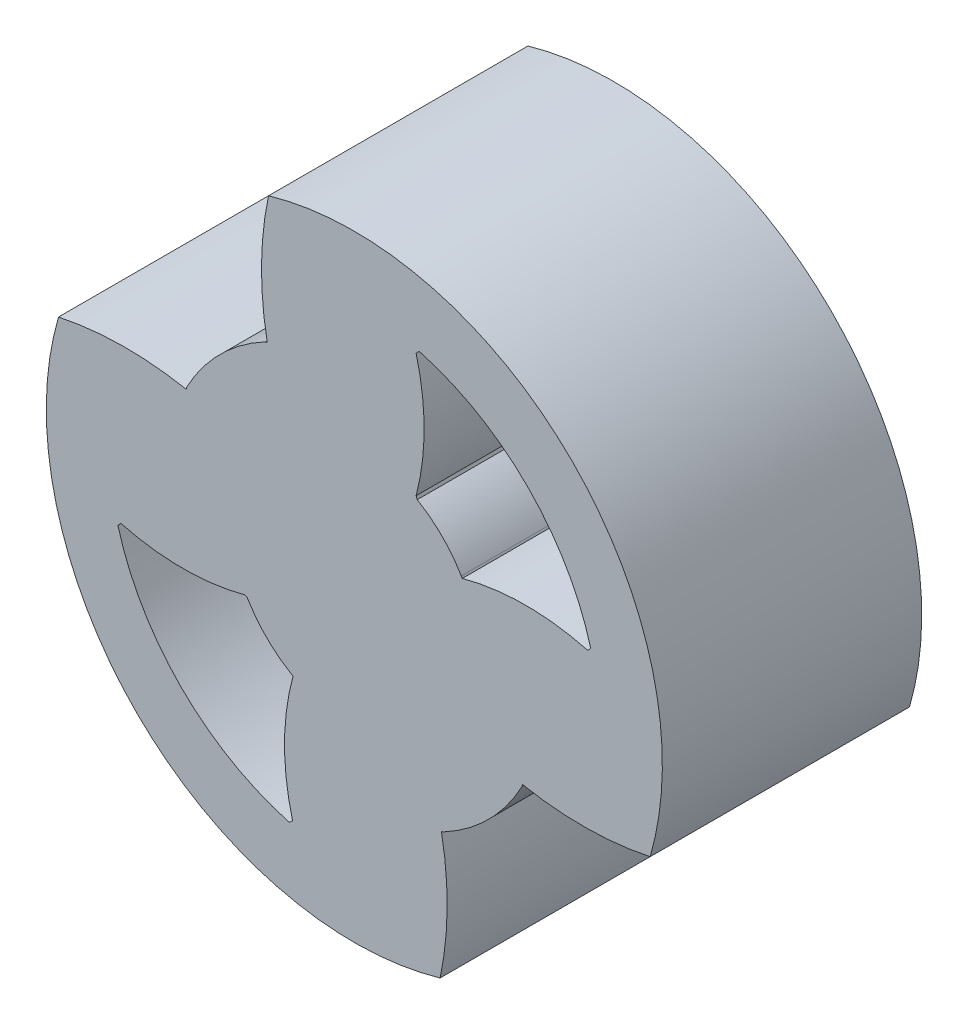
ISO-10303-21;
HEADER;
FILE_DESCRIPTION(('STEP AP214'),'2;1');
FILE_NAME('part.step','',(''),(''),'','','');
FILE_SCHEMA(('AUTOMOTIVE_DESIGN { 1 0 10303 214 1 1 1 1 }'));
ENDSEC;
DATA;
#1=APPLICATION_CONTEXT('core data for automotive mechanical design processes');
#2=APPLICATION_PROTOCOL_DEFINITION('international standard','automotive_design',2000,#1);
#3=PRODUCT_CONTEXT('',#1,'mechanical');
#4=PRODUCT('Part','Part','',(#3));
#5=PRODUCT_RELATED_PRODUCT_CATEGORY('part','',(#4));
#6=PRODUCT_DEFINITION_FORMATION('','',#4);
#7=PRODUCT_DEFINITION_CONTEXT('part definition',#1,'design');
#8=PRODUCT_DEFINITION('design','',#6,#7);
#9=PRODUCT_DEFINITION_SHAPE('','',#8);
#10=(LENGTH_UNIT() NAMED_UNIT(*) SI_UNIT(.MILLI.,.METRE.));
#11=(NAMED_UNIT(*) PLANE_ANGLE_UNIT() SI_UNIT($,.RADIAN.));
#12=(NAMED_UNIT(*) SI_UNIT($,.STERADIAN.) SOLID_ANGLE_UNIT());
#13=UNCERTAINTY_MEASURE_WITH_UNIT(LENGTH_MEASURE(1.E-05),#10,'distance_accuracy_value','');
#14=(GEOMETRIC_REPRESENTATION_CONTEXT(3) GLOBAL_UNCERTAINTY_ASSIGNED_CONTEXT((#13)) GLOBAL_UNIT_ASSIGNED_CONTEXT((#10,
#11,#12)) REPRESENTATION_CONTEXT('',''));
#15=CARTESIAN_POINT('',(0.,0.,0.));
#16=DIRECTION('',(0.,0.,1.));
#17=DIRECTION('',(1.,0.,0.));
#18=AXIS2_PLACEMENT_3D('',#15,#16,#17);
#19=CARTESIAN_POINT('',(4.4901280605346,4.49012806053456,10.1811666666667));
#20=DIRECTION('',(0.,0.,1.));
#21=DIRECTION('',(1.,0.,0.));
#22=AXIS2_PLACEMENT_3D('',#19,#20,#21);
#23=PLANE('',#22);
#24=DIRECTION('',(-0.987822713966027,-0.15558369378824,0.));
#25=VECTOR('',#24,1.);
#26=CARTESIAN_POINT('',(-3.48797259153331,6.58753116746421,10.1811666666667));
#27=LINE('',#26,#25);
#28=CARTESIAN_POINT('',(-3.41844841010291,6.59848133979941,10.1811666666667));
#29=VERTEX_POINT('',#28);
#30=CARTESIAN_POINT('',(-3.48797259153331,6.58753116746421,10.1811666666667));
#31=VERTEX_POINT('',#30);
#32=EDGE_CURVE('E355',#29,#31,#27,.T.);
#33=ORIENTED_EDGE('',*,*,#32,.T.);
#34=CARTESIAN_POINT('',(0.,0.,10.1811666666667));
#35=DIRECTION('',(0.,0.,1.));
#36=DIRECTION('',(1.,0.,0.));
#37=AXIS2_PLACEMENT_3D('',#34,#35,#36);
#38=CIRCLE('',#37,7.45396);
#39=CARTESIAN_POINT('',(-6.58753116746418,3.48797259153338,10.1811666666667));
#40=VERTEX_POINT('',#39);
#41=EDGE_CURVE('E426',#31,#40,#38,.T.);
#42=ORIENTED_EDGE('',*,*,#41,.T.);
#43=DIRECTION('',(-0.155583693788261,-0.987822713966024,0.));
#44=VECTOR('',#43,1.);
#45=CARTESIAN_POINT('',(-6.59848133979937,3.41844841010297,10.1811666666667));
#46=LINE('',#45,#44);
#47=CARTESIAN_POINT('',(-6.59848133979937,3.41844841010297,10.1811666666667));
#48=VERTEX_POINT('',#47);
#49=EDGE_CURVE('E423',#40,#48,#46,.T.);
#50=ORIENTED_EDGE('',*,*,#49,.T.);
#51=CARTESIAN_POINT('',(-8.9802561210692,-8.98025612106911,10.1811666666667));
#52=DIRECTION('',(0.,0.,1.));
#53=DIRECTION('',(1.,0.,0.));
#54=AXIS2_PLACEMENT_3D('',#51,#52,#53);
#55=CIRCLE('',#54,12.6254);
#56=CARTESIAN_POINT('',(-11.6136429652896,3.36745617265912,10.1811666666667));
#57=VERTEX_POINT('',#56);
#58=EDGE_CURVE('E420',#48,#57,#55,.T.);
#59=ORIENTED_EDGE('',*,*,#58,.T.);
#60=CARTESIAN_POINT('',(0.,0.,10.1811666666667));
#61=DIRECTION('',(0.,0.,1.));
#62=DIRECTION('',(1.,0.,0.));
#63=AXIS2_PLACEMENT_3D('',#60,#61,#62);
#64=CIRCLE('',#63,12.092);
#65=CARTESIAN_POINT('',(3.36745617265899,-11.6136429652896,10.1811666666667));
#66=VERTEX_POINT('',#65);
#67=EDGE_CURVE('E417',#57,#66,#64,.T.);
#68=ORIENTED_EDGE('',*,*,#67,.T.);
#69=CARTESIAN_POINT('',(-8.9802561210692,-8.98025612106911,10.1811666666667));
#70=DIRECTION('',(0.,0.,1.));
#71=DIRECTION('',(1.,0.,0.));
#72=AXIS2_PLACEMENT_3D('',#69,#70,#71);
#73=CIRCLE('',#72,12.6254);
#74=CARTESIAN_POINT('',(3.4184484101029,-6.59848133979941,10.1811666666667));
#75=VERTEX_POINT('',#74);
#76=EDGE_CURVE('E414',#66,#75,#73,.T.);
#77=ORIENTED_EDGE('',*,*,#76,.T.);
#78=DIRECTION('',(0.987822713966023,0.155583693788268,0.));
#79=VECTOR('',#78,1.);
#80=CARTESIAN_POINT('',(3.4184484101029,-6.59848133979941,10.1811666666667));
#81=LINE('',#80,#79);
#82=CARTESIAN_POINT('',(3.4879725915333,-6.58753116746421,10.1811666666667));
#83=VERTEX_POINT('',#82);
#84=EDGE_CURVE('E411',#75,#83,#81,.T.);
#85=ORIENTED_EDGE('',*,*,#84,.T.);
#86=CARTESIAN_POINT('',(0.,0.,10.1811666666667));
#87=DIRECTION('',(0.,0.,1.));
#88=DIRECTION('',(1.,0.,0.));
#89=AXIS2_PLACEMENT_3D('',#86,#87,#88);
#90=CIRCLE('',#89,7.45396);
#91=CARTESIAN_POINT('',(6.58753116746417,-3.48797259153338,10.1811666666667));
#92=VERTEX_POINT('',#91);
#93=EDGE_CURVE('E408',#83,#92,#90,.T.);
#94=ORIENTED_EDGE('',*,*,#93,.T.);
#95=DIRECTION('',(0.155583693788292,0.987822713966019,0.));
#96=VECTOR('',#95,1.);
#97=CARTESIAN_POINT('',(6.58753116746417,-3.48797259153338,10.1811666666667));
#98=LINE('',#97,#96);
#99=CARTESIAN_POINT('',(6.59848133979937,-3.41844841010297,10.1811666666667));
#100=VERTEX_POINT('',#99);
#101=EDGE_CURVE('E405',#92,#100,#98,.T.);
#102=ORIENTED_EDGE('',*,*,#101,.T.);
#103=CARTESIAN_POINT('',(8.9802561210692,8.98025612106911,10.1811666666667));
#104=DIRECTION('',(0.,0.,1.));
#105=DIRECTION('',(1.,0.,0.));
#106=AXIS2_PLACEMENT_3D('',#103,#104,#105);
#107=CIRCLE('',#106,12.6254);
#108=CARTESIAN_POINT('',(11.6136429652896,-3.36745617265912,10.1811666666667));
#109=VERTEX_POINT('',#108);
#110=EDGE_CURVE('E402',#100,#109,#107,.T.);
#111=ORIENTED_EDGE('',*,*,#110,.T.);
#112=CARTESIAN_POINT('',(0.,0.,10.1811666666667));
#113=DIRECTION('',(0.,0.,1.));
#114=DIRECTION('',(1.,0.,0.));
#115=AXIS2_PLACEMENT_3D('',#112,#113,#114);
#116=CIRCLE('',#115,12.092);
#117=CARTESIAN_POINT('',(-3.367456172659,11.6136429652896,10.1811666666667));
#118=VERTEX_POINT('',#117);
#119=EDGE_CURVE('E41',#109,#118,#116,.T.);
#120=ORIENTED_EDGE('',*,*,#119,.T.);
#121=CARTESIAN_POINT('',(8.9802561210692,8.98025612106911,10.1811666666667));
#122=DIRECTION('',(0.,0.,1.));
#123=DIRECTION('',(1.,0.,0.));
#124=AXIS2_PLACEMENT_3D('',#121,#122,#123);
#125=CIRCLE('',#124,12.6254);
#126=EDGE_CURVE('E11',#118,#29,#125,.T.);
#127=ORIENTED_EDGE('',*,*,#126,.T.);
#128=EDGE_LOOP('',(#33,#42,#50,#59,#68,#77,#85,#94,#102,#111,#120,#127));
#129=FACE_BOUND('',#128,.T.);
#130=DIRECTION('',(0.507142317837534,-0.861862326278608,0.));
#131=VECTOR('',#130,1.);
#132=CARTESIAN_POINT('',(4.20013091190001,2.47146680036411,10.1811666666667));
#133=LINE('',#132,#131);
#134=CARTESIAN_POINT('',(4.20013091190001,2.47146680036411,10.1811666666667));
#135=VERTEX_POINT('',#134);
#136=CARTESIAN_POINT('',(4.23874516139269,2.40584386627892,10.1811666666667));
#137=VERTEX_POINT('',#136);
#138=EDGE_CURVE('E57',#135,#137,#133,.T.);
#139=ORIENTED_EDGE('',*,*,#138,.F.);
#140=CARTESIAN_POINT('',(0.,0.,10.1811666666667));
#141=DIRECTION('',(0.,0.,-1.));
#142=DIRECTION('',(1.,0.,0.));
#143=AXIS2_PLACEMENT_3D('',#140,#141,#142);
#144=CIRCLE('',#143,4.87332);
#145=CARTESIAN_POINT('',(2.47146680036406,4.20013091190004,10.1811666666667));
#146=VERTEX_POINT('',#145);
#147=EDGE_CURVE('E327',#146,#135,#144,.T.);
#148=ORIENTED_EDGE('',*,*,#147,.F.);
#149=DIRECTION('',(0.380337202947121,-0.924847885900357,0.));
#150=VECTOR('',#149,1.);
#151=CARTESIAN_POINT('',(2.47146680036406,4.20013091190004,10.1811666666667));
#152=LINE('',#151,#150);
#153=CARTESIAN_POINT('',(2.42550636138454,4.31189072528641,10.1811666666667));
#154=VERTEX_POINT('',#153);
#155=EDGE_CURVE('E324',#154,#146,#152,.T.);
#156=ORIENTED_EDGE('',*,*,#155,.F.);
#157=CARTESIAN_POINT('',(-6.7351920908019,6.73519209080183,10.1811666666667));
#158=DIRECTION('',(0.,0.,-1.));
#159=DIRECTION('',(1.,0.,0.));
#160=AXIS2_PLACEMENT_3D('',#157,#158,#159);
#161=CIRCLE('',#160,9.4758);
#162=CARTESIAN_POINT('',(2.42524290502535,9.15948916979677,10.1811666666667));
#163=VERTEX_POINT('',#162);
#164=EDGE_CURVE('E321',#163,#154,#161,.T.);
#165=ORIENTED_EDGE('',*,*,#164,.F.);
#166=DIRECTION('',(-0.710368113398535,-0.703830337131475,0.));
#167=VECTOR('',#166,1.);
#168=CARTESIAN_POINT('',(2.42524290502535,9.15948916979677,10.1811666666667));
#169=LINE('',#168,#167);
#170=CARTESIAN_POINT('',(2.5483915912344,9.28150447382997,10.1811666666667));
#171=VERTEX_POINT('',#170);
#172=EDGE_CURVE('E318',#171,#163,#169,.T.);
#173=ORIENTED_EDGE('',*,*,#172,.F.);
#174=CARTESIAN_POINT('',(0.,0.,10.1811666666667));
#175=DIRECTION('',(0.,0.,1.));
#176=DIRECTION('',(1.,0.,0.));
#177=AXIS2_PLACEMENT_3D('',#174,#175,#176);
#178=CIRCLE('',#177,9.625);
#179=CARTESIAN_POINT('',(9.28150447382994,2.54839159123451,10.1811666666667));
#180=VERTEX_POINT('',#179);
#181=EDGE_CURVE('E315',#180,#171,#178,.T.);
#182=ORIENTED_EDGE('',*,*,#181,.F.);
#183=DIRECTION('',(0.703830337131452,0.710368113398558,0.));
#184=VECTOR('',#183,1.);
#185=CARTESIAN_POINT('',(9.15948916979674,2.42524290502545,10.1811666666667));
#186=LINE('',#185,#184);
#187=CARTESIAN_POINT('',(9.15948916979674,2.42524290502545,10.1811666666667));
#188=VERTEX_POINT('',#187);
#189=EDGE_CURVE('E312',#188,#180,#186,.T.);
#190=ORIENTED_EDGE('',*,*,#189,.F.);
#191=CARTESIAN_POINT('',(6.73519209080191,-6.73519209080183,10.1811666666667));
#192=DIRECTION('',(0.,0.,-1.));
#193=DIRECTION('',(1.,0.,0.));
#194=AXIS2_PLACEMENT_3D('',#191,#192,#193);
#195=CIRCLE('',#194,9.4758);
#196=EDGE_CURVE('E274',#137,#188,#195,.T.);
#197=ORIENTED_EDGE('',*,*,#196,.F.);
#198=EDGE_LOOP('',(#139,#148,#156,#165,#173,#182,#190,#197));
#199=FACE_BOUND('',#198,.T.);
#200=DIRECTION('',(0.861862326278608,-0.507142317837534,0.));
#201=VECTOR('',#200,1.);
#202=CARTESIAN_POINT('',(-2.47146680036411,-4.20013091190001,10.1811666666667));
#203=LINE('',#202,#201);
#204=CARTESIAN_POINT('',(-2.47146680036411,-4.20013091190001,10.1811666666667));
#205=VERTEX_POINT('',#204);
#206=CARTESIAN_POINT('',(-2.40584386627893,-4.23874516139268,10.1811666666667));
#207=VERTEX_POINT('',#206);
#208=EDGE_CURVE('E253',#205,#207,#203,.T.);
#209=ORIENTED_EDGE('',*,*,#208,.T.);
#210=CARTESIAN_POINT('',(6.73519209080183,-6.7351920908019,10.1811666666667));
#211=DIRECTION('',(0.,0.,1.));
#212=DIRECTION('',(0.,-1.,0.));
#213=AXIS2_PLACEMENT_3D('',#210,#211,#212);
#214=CIRCLE('',#213,9.4758);
#215=CARTESIAN_POINT('',(-2.42524290502545,-9.15948916979674,10.1811666666667));
#216=VERTEX_POINT('',#215);
#217=EDGE_CURVE('E232',#207,#216,#214,.T.);
#218=ORIENTED_EDGE('',*,*,#217,.T.);
#219=DIRECTION('',(-0.710368113398558,-0.703830337131452,0.));
#220=VECTOR('',#219,1.);
#221=CARTESIAN_POINT('',(-2.42524290502545,-9.15948916979674,10.1811666666667));
#222=LINE('',#221,#220);
#223=CARTESIAN_POINT('',(-2.54839159123451,-9.28150447382995,10.1811666666667));
#224=VERTEX_POINT('',#223);
#225=EDGE_CURVE('E240',#216,#224,#222,.T.);
#226=ORIENTED_EDGE('',*,*,#225,.T.);
#227=CARTESIAN_POINT('',(0.,0.,10.1811666666667));
#228=DIRECTION('',(0.,0.,-1.));
#229=DIRECTION('',(0.,-1.,0.));
#230=AXIS2_PLACEMENT_3D('',#227,#228,#229);
#231=CIRCLE('',#230,9.625);
#232=CARTESIAN_POINT('',(-9.28150447382997,-2.54839159123441,10.1811666666667));
#233=VERTEX_POINT('',#232);
#234=EDGE_CURVE('E267',#224,#233,#231,.T.);
#235=ORIENTED_EDGE('',*,*,#234,.T.);
#236=DIRECTION('',(0.703830337131475,0.710368113398535,0.));
#237=VECTOR('',#236,1.);
#238=CARTESIAN_POINT('',(-9.15948916979677,-2.42524290502535,10.1811666666667));
#239=LINE('',#238,#237);
#240=CARTESIAN_POINT('',(-9.15948916979677,-2.42524290502535,10.1811666666667));
#241=VERTEX_POINT('',#240);
#242=EDGE_CURVE('E264',#233,#241,#239,.T.);
#243=ORIENTED_EDGE('',*,*,#242,.T.);
#244=CARTESIAN_POINT('',(-6.73519209080184,6.7351920908019,10.1811666666667));
#245=DIRECTION('',(0.,0.,1.));
#246=DIRECTION('',(0.,-1.,0.));
#247=AXIS2_PLACEMENT_3D('',#244,#245,#246);
#248=CIRCLE('',#247,9.4758);
#249=CARTESIAN_POINT('',(-4.31189072528641,-2.42550636138454,10.1811666666667));
#250=VERTEX_POINT('',#249);
#251=EDGE_CURVE('E261',#241,#250,#248,.T.);
#252=ORIENTED_EDGE('',*,*,#251,.T.);
#253=DIRECTION('',(0.924847885900358,-0.38033720294712,0.));
#254=VECTOR('',#253,1.);
#255=CARTESIAN_POINT('',(-4.20013091190004,-2.47146680036406,10.1811666666667));
#256=LINE('',#255,#254);
#257=CARTESIAN_POINT('',(-4.20013091190004,-2.47146680036406,10.1811666666667));
#258=VERTEX_POINT('',#257);
#259=EDGE_CURVE('E258',#250,#258,#256,.T.);
#260=ORIENTED_EDGE('',*,*,#259,.T.);
#261=CARTESIAN_POINT('',(0.,0.,10.1811666666667));
#262=DIRECTION('',(0.,0.,1.));
#263=DIRECTION('',(0.,-1.,0.));
#264=AXIS2_PLACEMENT_3D('',#261,#262,#263);
#265=CIRCLE('',#264,4.87332);
#266=EDGE_CURVE('E255',#258,#205,#265,.T.);
#267=ORIENTED_EDGE('',*,*,#266,.T.);
#268=EDGE_LOOP('',(#209,#218,#226,#235,#243,#252,#260,#267));
#269=FACE_BOUND('',#268,.T.);
#270=ADVANCED_FACE('F33',(#129,#199,#269),#23,.T.);
#271=CARTESIAN_POINT('',(0.,0.,44.3825074590976));
#272=DIRECTION('',(0.,0.,-1.));
#273=DIRECTION('',(-1.,0.,0.));
#274=AXIS2_PLACEMENT_3D('',#271,#272,#273);
#275=CYLINDRICAL_SURFACE('',#274,7.45396);
#276=ORIENTED_EDGE('',*,*,#41,.F.);
#277=DIRECTION('',(0.,0.,-1.));
#278=VECTOR('',#277,1.);
#279=CARTESIAN_POINT('',(-3.48797259153331,6.58753116746421,44.3825074590976));
#280=LINE('',#279,#278);
#281=CARTESIAN_POINT('',(-3.48797259153331,6.58753116746421,0.));
#282=VERTEX_POINT('',#281);
#283=EDGE_CURVE('E36',#31,#282,#280,.T.);
#284=ORIENTED_EDGE('',*,*,#283,.T.);
#285=CARTESIAN_POINT('',(0.,0.,0.));
#286=DIRECTION('',(0.,0.,1.));
#287=DIRECTION('',(1.,0.,0.));
#288=AXIS2_PLACEMENT_3D('',#285,#286,#287);
#289=CIRCLE('',#288,7.45396);
#290=CARTESIAN_POINT('',(-6.58753116746418,3.48797259153338,0.));
#291=VERTEX_POINT('',#290);
#292=EDGE_CURVE('E397',#282,#291,#289,.T.);
#293=ORIENTED_EDGE('',*,*,#292,.T.);
#294=DIRECTION('',(0.,0.,-1.));
#295=VECTOR('',#294,1.);
#296=CARTESIAN_POINT('',(-6.58753116746418,3.48797259153338,44.3825074590976));
#297=LINE('',#296,#295);
#298=EDGE_CURVE('E396',#40,#291,#297,.T.);
#299=ORIENTED_EDGE('',*,*,#298,.F.);
#300=EDGE_LOOP('',(#276,#284,#293,#299));
#301=FACE_BOUND('',#300,.T.);
#302=ADVANCED_FACE('F457',(#301),#275,.T.);
#303=CARTESIAN_POINT('',(-6.59848133979937,3.41844841010297,44.3825074590976));
#304=DIRECTION('',(0.987822713966024,-0.155583693788261,0.));
#305=DIRECTION('',(0.155583693788261,0.987822713966024,0.));
#306=AXIS2_PLACEMENT_3D('',#303,#304,#305);
#307=PLANE('',#306);
#308=ORIENTED_EDGE('',*,*,#49,.F.);
#309=ORIENTED_EDGE('',*,*,#298,.T.);
#310=DIRECTION('',(-0.155583693788261,-0.987822713966024,0.));
#311=VECTOR('',#310,1.);
#312=CARTESIAN_POINT('',(-6.59848133979937,3.41844841010297,0.));
#313=LINE('',#312,#311);
#314=CARTESIAN_POINT('',(-6.59848133979937,3.41844841010297,0.));
#315=VERTEX_POINT('',#314);
#316=EDGE_CURVE('E393',#291,#315,#313,.T.);
#317=ORIENTED_EDGE('',*,*,#316,.T.);
#318=DIRECTION('',(0.,0.,-1.));
#319=VECTOR('',#318,1.);
#320=CARTESIAN_POINT('',(-6.59848133979937,3.41844841010297,44.3825074590976));
#321=LINE('',#320,#319);
#322=EDGE_CURVE('E392',#48,#315,#321,.T.);
#323=ORIENTED_EDGE('',*,*,#322,.F.);
#324=EDGE_LOOP('',(#308,#309,#317,#323));
#325=FACE_BOUND('',#324,.T.);
#326=ADVANCED_FACE('F491',(#325),#307,.F.);
#327=CARTESIAN_POINT('',(-8.9802561210692,-8.98025612106911,44.3825074590976));
#328=DIRECTION('',(0.,0.,-1.));
#329=DIRECTION('',(-1.,0.,0.));
#330=AXIS2_PLACEMENT_3D('',#327,#328,#329);
#331=CYLINDRICAL_SURFACE('',#330,12.6254);
#332=ORIENTED_EDGE('',*,*,#58,.F.);
#333=ORIENTED_EDGE('',*,*,#322,.T.);
#334=CARTESIAN_POINT('',(-8.9802561210692,-8.98025612106911,0.));
#335=DIRECTION('',(0.,0.,1.));
#336=DIRECTION('',(1.,0.,0.));
#337=AXIS2_PLACEMENT_3D('',#334,#335,#336);
#338=CIRCLE('',#337,12.6254);
#339=CARTESIAN_POINT('',(-11.6136429652896,3.36745617265912,0.));
#340=VERTEX_POINT('',#339);
#341=EDGE_CURVE('E389',#315,#340,#338,.T.);
#342=ORIENTED_EDGE('',*,*,#341,.T.);
#343=DIRECTION('',(0.,0.,-1.));
#344=VECTOR('',#343,1.);
#345=CARTESIAN_POINT('',(-11.6136429652896,3.36745617265912,44.3825074590976));
#346=LINE('',#345,#344);
#347=EDGE_CURVE('E388',#57,#340,#346,.T.);
#348=ORIENTED_EDGE('',*,*,#347,.F.);
#349=EDGE_LOOP('',(#332,#333,#342,#348));
#350=FACE_BOUND('',#349,.T.);
#351=ADVANCED_FACE('F488',(#350),#331,.T.);
#352=CARTESIAN_POINT('',(0.,0.,44.3825074590976));
#353=DIRECTION('',(0.,0.,-1.));
#354=DIRECTION('',(-1.,0.,0.));
#355=AXIS2_PLACEMENT_3D('',#352,#353,#354);
#356=CYLINDRICAL_SURFACE('',#355,12.092);
#357=ORIENTED_EDGE('',*,*,#67,.F.);
#358=ORIENTED_EDGE('',*,*,#347,.T.);
#359=CARTESIAN_POINT('',(0.,0.,0.));
#360=DIRECTION('',(0.,0.,1.));
#361=DIRECTION('',(1.,0.,0.));
#362=AXIS2_PLACEMENT_3D('',#359,#360,#361);
#363=CIRCLE('',#362,12.092);
#364=CARTESIAN_POINT('',(3.36745617265899,-11.6136429652896,0.));
#365=VERTEX_POINT('',#364);
#366=EDGE_CURVE('E385',#340,#365,#363,.T.);
#367=ORIENTED_EDGE('',*,*,#366,.T.);
#368=DIRECTION('',(0.,0.,-1.));
#369=VECTOR('',#368,1.);
#370=CARTESIAN_POINT('',(3.36745617265899,-11.6136429652896,44.3825074590976));
#371=LINE('',#370,#369);
#372=EDGE_CURVE('E384',#66,#365,#371,.T.);
#373=ORIENTED_EDGE('',*,*,#372,.F.);
#374=EDGE_LOOP('',(#357,#358,#367,#373));
#375=FACE_BOUND('',#374,.T.);
#376=ADVANCED_FACE('F485',(#375),#356,.T.);
#377=CARTESIAN_POINT('',(-8.9802561210692,-8.98025612106911,44.3825074590976));
#378=DIRECTION('',(0.,0.,-1.));
#379=DIRECTION('',(-1.,0.,0.));
#380=AXIS2_PLACEMENT_3D('',#377,#378,#379);
#381=CYLINDRICAL_SURFACE('',#380,12.6254);
#382=ORIENTED_EDGE('',*,*,#76,.F.);
#383=ORIENTED_EDGE('',*,*,#372,.T.);
#384=CARTESIAN_POINT('',(-8.9802561210692,-8.98025612106911,0.));
#385=DIRECTION('',(0.,0.,1.));
#386=DIRECTION('',(1.,0.,0.));
#387=AXIS2_PLACEMENT_3D('',#384,#385,#386);
#388=CIRCLE('',#387,12.6254);
#389=CARTESIAN_POINT('',(3.4184484101029,-6.59848133979941,0.));
#390=VERTEX_POINT('',#389);
#391=EDGE_CURVE('E381',#365,#390,#388,.T.);
#392=ORIENTED_EDGE('',*,*,#391,.T.);
#393=DIRECTION('',(0.,0.,-1.));
#394=VECTOR('',#393,1.);
#395=CARTESIAN_POINT('',(3.4184484101029,-6.59848133979941,44.3825074590976));
#396=LINE('',#395,#394);
#397=EDGE_CURVE('E380',#75,#390,#396,.T.);
#398=ORIENTED_EDGE('',*,*,#397,.F.);
#399=EDGE_LOOP('',(#382,#383,#392,#398));
#400=FACE_BOUND('',#399,.T.);
#401=ADVANCED_FACE('F482',(#400),#381,.T.);
#402=CARTESIAN_POINT('',(3.4184484101029,-6.59848133979941,44.3825074590976));
#403=DIRECTION('',(-0.155583693788268,0.987822713966022,0.));
#404=DIRECTION('',(-0.987822713966023,-0.155583693788268,0.));
#405=AXIS2_PLACEMENT_3D('',#402,#403,#404);
#406=PLANE('',#405);
#407=ORIENTED_EDGE('',*,*,#84,.F.);
#408=ORIENTED_EDGE('',*,*,#397,.T.);
#409=DIRECTION('',(0.987822713966023,0.155583693788268,0.));
#410=VECTOR('',#409,1.);
#411=CARTESIAN_POINT('',(3.4184484101029,-6.59848133979941,0.));
#412=LINE('',#411,#410);
#413=CARTESIAN_POINT('',(3.4879725915333,-6.58753116746421,0.));
#414=VERTEX_POINT('',#413);
#415=EDGE_CURVE('E377',#390,#414,#412,.T.);
#416=ORIENTED_EDGE('',*,*,#415,.T.);
#417=DIRECTION('',(0.,0.,-1.));
#418=VECTOR('',#417,1.);
#419=CARTESIAN_POINT('',(3.4879725915333,-6.58753116746421,44.3825074590976));
#420=LINE('',#419,#418);
#421=EDGE_CURVE('E376',#83,#414,#420,.T.);
#422=ORIENTED_EDGE('',*,*,#421,.F.);
#423=EDGE_LOOP('',(#407,#408,#416,#422));
#424=FACE_BOUND('',#423,.T.);
#425=ADVANCED_FACE('F479',(#424),#406,.F.);
#426=CARTESIAN_POINT('',(0.,0.,44.3825074590976));
#427=DIRECTION('',(0.,0.,-1.));
#428=DIRECTION('',(-1.,0.,0.));
#429=AXIS2_PLACEMENT_3D('',#426,#427,#428);
#430=CYLINDRICAL_SURFACE('',#429,7.45396);
#431=ORIENTED_EDGE('',*,*,#93,.F.);
#432=ORIENTED_EDGE('',*,*,#421,.T.);
#433=CARTESIAN_POINT('',(0.,0.,0.));
#434=DIRECTION('',(0.,0.,1.));
#435=DIRECTION('',(1.,0.,0.));
#436=AXIS2_PLACEMENT_3D('',#433,#434,#435);
#437=CIRCLE('',#436,7.45396);
#438=CARTESIAN_POINT('',(6.58753116746417,-3.48797259153338,0.));
#439=VERTEX_POINT('',#438);
#440=EDGE_CURVE('E373',#414,#439,#437,.T.);
#441=ORIENTED_EDGE('',*,*,#440,.T.);
#442=DIRECTION('',(0.,0.,-1.));
#443=VECTOR('',#442,1.);
#444=CARTESIAN_POINT('',(6.58753116746417,-3.48797259153338,44.3825074590976));
#445=LINE('',#444,#443);
#446=EDGE_CURVE('E372',#92,#439,#445,.T.);
#447=ORIENTED_EDGE('',*,*,#446,.F.);
#448=EDGE_LOOP('',(#431,#432,#441,#447));
#449=FACE_BOUND('',#448,.T.);
#450=ADVANCED_FACE('F473',(#449),#430,.T.);
#451=CARTESIAN_POINT('',(6.58753116746417,-3.48797259153338,44.3825074590976));
#452=DIRECTION('',(-0.987822713966019,0.155583693788292,0.));
#453=DIRECTION('',(-0.155583693788292,-0.987822713966019,0.));
#454=AXIS2_PLACEMENT_3D('',#451,#452,#453);
#455=PLANE('',#454);
#456=ORIENTED_EDGE('',*,*,#101,.F.);
#457=ORIENTED_EDGE('',*,*,#446,.T.);
#458=DIRECTION('',(0.155583693788292,0.987822713966019,0.));
#459=VECTOR('',#458,1.);
#460=CARTESIAN_POINT('',(6.58753116746417,-3.48797259153338,0.));
#461=LINE('',#460,#459);
#462=CARTESIAN_POINT('',(6.59848133979937,-3.41844841010297,0.));
#463=VERTEX_POINT('',#462);
#464=EDGE_CURVE('E369',#439,#463,#461,.T.);
#465=ORIENTED_EDGE('',*,*,#464,.T.);
#466=DIRECTION('',(0.,0.,-1.));
#467=VECTOR('',#466,1.);
#468=CARTESIAN_POINT('',(6.59848133979937,-3.41844841010297,44.3825074590976));
#469=LINE('',#468,#467);
#470=EDGE_CURVE('E368',#100,#463,#469,.T.);
#471=ORIENTED_EDGE('',*,*,#470,.F.);
#472=EDGE_LOOP('',(#456,#457,#465,#471));
#473=FACE_BOUND('',#472,.T.);
#474=ADVANCED_FACE('F470',(#473),#455,.F.);
#475=CARTESIAN_POINT('',(8.9802561210692,8.98025612106911,44.3825074590976));
#476=DIRECTION('',(0.,0.,-1.));
#477=DIRECTION('',(-1.,0.,0.));
#478=AXIS2_PLACEMENT_3D('',#475,#476,#477);
#479=CYLINDRICAL_SURFACE('',#478,12.6254);
#480=ORIENTED_EDGE('',*,*,#110,.F.);
#481=ORIENTED_EDGE('',*,*,#470,.T.);
#482=CARTESIAN_POINT('',(8.9802561210692,8.98025612106911,0.));
#483=DIRECTION('',(0.,0.,1.));
#484=DIRECTION('',(1.,0.,0.));
#485=AXIS2_PLACEMENT_3D('',#482,#483,#484);
#486=CIRCLE('',#485,12.6254);
#487=CARTESIAN_POINT('',(11.6136429652896,-3.36745617265912,0.));
#488=VERTEX_POINT('',#487);
#489=EDGE_CURVE('E365',#463,#488,#486,.T.);
#490=ORIENTED_EDGE('',*,*,#489,.T.);
#491=DIRECTION('',(0.,0.,-1.));
#492=VECTOR('',#491,1.);
#493=CARTESIAN_POINT('',(11.6136429652896,-3.36745617265912,44.3825074590976));
#494=LINE('',#493,#492);
#495=EDGE_CURVE('E364',#109,#488,#494,.T.);
#496=ORIENTED_EDGE('',*,*,#495,.F.);
#497=EDGE_LOOP('',(#480,#481,#490,#496));
#498=FACE_BOUND('',#497,.T.);
#499=ADVANCED_FACE('F467',(#498),#479,.T.);
#500=CARTESIAN_POINT('',(0.,0.,44.3825074590976));
#501=DIRECTION('',(0.,0.,-1.));
#502=DIRECTION('',(-1.,0.,0.));
#503=AXIS2_PLACEMENT_3D('',#500,#501,#502);
#504=CYLINDRICAL_SURFACE('',#503,12.092);
#505=ORIENTED_EDGE('',*,*,#119,.F.);
#506=ORIENTED_EDGE('',*,*,#495,.T.);
#507=CARTESIAN_POINT('',(0.,0.,0.));
#508=DIRECTION('',(0.,0.,1.));
#509=DIRECTION('',(1.,0.,0.));
#510=AXIS2_PLACEMENT_3D('',#507,#508,#509);
#511=CIRCLE('',#510,12.092);
#512=CARTESIAN_POINT('',(-3.367456172659,11.6136429652896,0.));
#513=VERTEX_POINT('',#512);
#514=EDGE_CURVE('E361',#488,#513,#511,.T.);
#515=ORIENTED_EDGE('',*,*,#514,.T.);
#516=DIRECTION('',(0.,0.,-1.));
#517=VECTOR('',#516,1.);
#518=CARTESIAN_POINT('',(-3.367456172659,11.6136429652896,44.3825074590976));
#519=LINE('',#518,#517);
#520=EDGE_CURVE('E360',#118,#513,#519,.T.);
#521=ORIENTED_EDGE('',*,*,#520,.F.);
#522=EDGE_LOOP('',(#505,#506,#515,#521));
#523=FACE_BOUND('',#522,.T.);
#524=ADVANCED_FACE('F461',(#523),#504,.T.);
#525=CARTESIAN_POINT('',(8.9802561210692,8.98025612106911,44.3825074590976));
#526=DIRECTION('',(0.,0.,-1.));
#527=DIRECTION('',(-1.,0.,0.));
#528=AXIS2_PLACEMENT_3D('',#525,#526,#527);
#529=CYLINDRICAL_SURFACE('',#528,12.6254);
#530=ORIENTED_EDGE('',*,*,#126,.F.);
#531=ORIENTED_EDGE('',*,*,#520,.T.);
#532=CARTESIAN_POINT('',(8.9802561210692,8.98025612106911,0.));
#533=DIRECTION('',(0.,0.,1.));
#534=DIRECTION('',(1.,0.,0.));
#535=AXIS2_PLACEMENT_3D('',#532,#533,#534);
#536=CIRCLE('',#535,12.6254);
#537=CARTESIAN_POINT('',(-3.41844841010291,6.59848133979941,0.));
#538=VERTEX_POINT('',#537);
#539=EDGE_CURVE('E357',#513,#538,#536,.T.);
#540=ORIENTED_EDGE('',*,*,#539,.T.);
#541=DIRECTION('',(0.,0.,-1.));
#542=VECTOR('',#541,1.);
#543=CARTESIAN_POINT('',(-3.41844841010291,6.59848133979941,44.3825074590976));
#544=LINE('',#543,#542);
#545=EDGE_CURVE('E356',#29,#538,#544,.T.);
#546=ORIENTED_EDGE('',*,*,#545,.F.);
#547=EDGE_LOOP('',(#530,#531,#540,#546));
#548=FACE_BOUND('',#547,.T.);
#549=ADVANCED_FACE('F447',(#548),#529,.T.);
#550=CARTESIAN_POINT('',(-3.48797259153331,6.58753116746421,44.3825074590976));
#551=DIRECTION('',(0.15558369378824,-0.987822713966027,0.));
#552=DIRECTION('',(0.987822713966027,0.15558369378824,0.));
#553=AXIS2_PLACEMENT_3D('',#550,#551,#552);
#554=PLANE('',#553);
#555=ORIENTED_EDGE('',*,*,#32,.F.);
#556=ORIENTED_EDGE('',*,*,#545,.T.);
#557=DIRECTION('',(-0.987822713966027,-0.15558369378824,0.));
#558=VECTOR('',#557,1.);
#559=CARTESIAN_POINT('',(-3.48797259153331,6.58753116746421,0.));
#560=LINE('',#559,#558);
#561=EDGE_CURVE('E352',#538,#282,#560,.T.);
#562=ORIENTED_EDGE('',*,*,#561,.T.);
#563=ORIENTED_EDGE('',*,*,#283,.F.);
#564=EDGE_LOOP('',(#555,#556,#562,#563));
#565=FACE_BOUND('',#564,.T.);
#566=ADVANCED_FACE('F442',(#565),#554,.F.);
#567=CARTESIAN_POINT('',(0.,0.,0.));
#568=DIRECTION('',(0.,0.,1.));
#569=DIRECTION('',(1.,0.,0.));
#570=AXIS2_PLACEMENT_3D('',#567,#568,#569);
#571=PLANE('',#570);
#572=CARTESIAN_POINT('',(0.,0.,0.));
#573=DIRECTION('',(0.,0.,-1.));
#574=DIRECTION('',(-1.,0.,0.));
#575=AXIS2_PLACEMENT_3D('',#572,#573,#574);
#576=CIRCLE('',#575,5.);
#577=CARTESIAN_POINT('',(-5.,0.,0.));
#578=VERTEX_POINT('',#577);
#579=EDGE_CURVE('E333',#578,#578,#576,.T.);
#580=ORIENTED_EDGE('',*,*,#579,.F.);
#581=EDGE_LOOP('',(#580));
#582=FACE_BOUND('',#581,.T.);
#583=ORIENTED_EDGE('',*,*,#292,.F.);
#584=ORIENTED_EDGE('',*,*,#561,.F.);
#585=ORIENTED_EDGE('',*,*,#539,.F.);
#586=ORIENTED_EDGE('',*,*,#514,.F.);
#587=ORIENTED_EDGE('',*,*,#489,.F.);
#588=ORIENTED_EDGE('',*,*,#464,.F.);
#589=ORIENTED_EDGE('',*,*,#440,.F.);
#590=ORIENTED_EDGE('',*,*,#415,.F.);
#591=ORIENTED_EDGE('',*,*,#391,.F.);
#592=ORIENTED_EDGE('',*,*,#366,.F.);
#593=ORIENTED_EDGE('',*,*,#341,.F.);
#594=ORIENTED_EDGE('',*,*,#316,.F.);
#595=EDGE_LOOP('',(#583,#584,#585,#586,#587,#588,#589,#590,#591,#592,#593,#594));
#596=FACE_BOUND('',#595,.T.);
#597=ADVANCED_FACE('F451',(#582,#596),#571,.F.);
#598=CARTESIAN_POINT('',(0.,0.,1.));
#599=DIRECTION('',(0.,0.,-1.));
#600=DIRECTION('',(-1.,0.,0.));
#601=AXIS2_PLACEMENT_3D('',#598,#599,#600);
#602=CYLINDRICAL_SURFACE('',#601,5.);
#603=CARTESIAN_POINT('',(0.,0.,1.));
#604=DIRECTION('',(0.,0.,-1.));
#605=DIRECTION('',(-1.,0.,0.));
#606=AXIS2_PLACEMENT_3D('',#603,#604,#605);
#607=CIRCLE('',#606,5.);
#608=CARTESIAN_POINT('',(-5.,0.,1.));
#609=VERTEX_POINT('',#608);
#610=EDGE_CURVE('E347',#609,#609,#607,.T.);
#611=ORIENTED_EDGE('',*,*,#610,.F.);
#612=EDGE_LOOP('',(#611));
#613=FACE_BOUND('',#612,.T.);
#614=ORIENTED_EDGE('',*,*,#579,.T.);
#615=EDGE_LOOP('',(#614));
#616=FACE_BOUND('',#615,.T.);
#617=ADVANCED_FACE('F632',(#613,#616),#602,.F.);
#618=CARTESIAN_POINT('',(0.,0.,1.));
#619=DIRECTION('',(0.,0.,-1.));
#620=DIRECTION('',(-1.,0.,0.));
#621=AXIS2_PLACEMENT_3D('',#618,#619,#620);
#622=PLANE('',#621);
#623=ORIENTED_EDGE('',*,*,#610,.T.);
#624=EDGE_LOOP('',(#623));
#625=FACE_BOUND('',#624,.T.);
#626=ADVANCED_FACE('F604',(#625),#622,.T.);
#627=CARTESIAN_POINT('',(4.20013091190001,2.47146680036411,2.68116666666666));
#628=DIRECTION('',(-0.861862326278608,-0.507142317837534,0.));
#629=DIRECTION('',(0.507142317837534,-0.861862326278608,0.));
#630=AXIS2_PLACEMENT_3D('',#627,#628,#629);
#631=PLANE('',#630);
#632=ORIENTED_EDGE('',*,*,#138,.T.);
#633=DIRECTION('',(0.,0.,1.));
#634=VECTOR('',#633,1.);
#635=CARTESIAN_POINT('',(4.23874516139269,2.40584386627893,2.68116666666666));
#636=LINE('',#635,#634);
#637=CARTESIAN_POINT('',(4.23874516139269,2.40584386627893,2.68116666666666));
#638=VERTEX_POINT('',#637);
#639=EDGE_CURVE('E331',#638,#137,#636,.T.);
#640=ORIENTED_EDGE('',*,*,#639,.F.);
#641=DIRECTION('',(0.507142317837534,-0.861862326278608,0.));
#642=VECTOR('',#641,1.);
#643=CARTESIAN_POINT('',(4.20013091190001,2.47146680036411,2.68116666666666));
#644=LINE('',#643,#642);
#645=CARTESIAN_POINT('',(4.20013091190001,2.47146680036411,2.68116666666666));
#646=VERTEX_POINT('',#645);
#647=EDGE_CURVE('E306',#646,#638,#644,.T.);
#648=ORIENTED_EDGE('',*,*,#647,.F.);
#649=DIRECTION('',(0.,0.,1.));
#650=VECTOR('',#649,1.);
#651=CARTESIAN_POINT('',(4.20013091190001,2.47146680036411,2.68116666666666));
#652=LINE('',#651,#650);
#653=EDGE_CURVE('E334',#646,#135,#652,.T.);
#654=ORIENTED_EDGE('',*,*,#653,.T.);
#655=EDGE_LOOP('',(#632,#640,#648,#654));
#656=FACE_BOUND('',#655,.T.);
#657=ADVANCED_FACE('F601',(#656),#631,.F.);
#658=CARTESIAN_POINT('',(0.,0.,2.68116666666666));
#659=DIRECTION('',(0.,0.,1.));
#660=DIRECTION('',(1.,0.,0.));
#661=AXIS2_PLACEMENT_3D('',#658,#659,#660);
#662=CYLINDRICAL_SURFACE('',#661,4.87332);
#663=ORIENTED_EDGE('',*,*,#147,.T.);
#664=ORIENTED_EDGE('',*,*,#653,.F.);
#665=CARTESIAN_POINT('',(0.,0.,2.68116666666666));
#666=DIRECTION('',(0.,0.,-1.));
#667=DIRECTION('',(1.,0.,0.));
#668=AXIS2_PLACEMENT_3D('',#665,#666,#667);
#669=CIRCLE('',#668,4.87332);
#670=CARTESIAN_POINT('',(2.47146680036406,4.20013091190004,2.68116666666666));
#671=VERTEX_POINT('',#670);
#672=EDGE_CURVE('E303',#671,#646,#669,.T.);
#673=ORIENTED_EDGE('',*,*,#672,.F.);
#674=DIRECTION('',(0.,0.,1.));
#675=VECTOR('',#674,1.);
#676=CARTESIAN_POINT('',(2.47146680036406,4.20013091190004,2.68116666666666));
#677=LINE('',#676,#675);
#678=EDGE_CURVE('E336',#671,#146,#677,.T.);
#679=ORIENTED_EDGE('',*,*,#678,.T.);
#680=EDGE_LOOP('',(#663,#664,#673,#679));
#681=FACE_BOUND('',#680,.T.);
#682=ADVANCED_FACE('F603',(#681),#662,.T.);
#683=CARTESIAN_POINT('',(2.47146680036406,4.20013091190004,2.68116666666666));
#684=DIRECTION('',(-0.924847885900357,-0.380337202947121,0.));
#685=DIRECTION('',(0.380337202947121,-0.924847885900357,0.));
#686=AXIS2_PLACEMENT_3D('',#683,#684,#685);
#687=PLANE('',#686);
#688=ORIENTED_EDGE('',*,*,#155,.T.);
#689=ORIENTED_EDGE('',*,*,#678,.F.);
#690=DIRECTION('',(0.380337202947121,-0.924847885900357,0.));
#691=VECTOR('',#690,1.);
#692=CARTESIAN_POINT('',(2.47146680036406,4.20013091190004,2.68116666666666));
#693=LINE('',#692,#691);
#694=CARTESIAN_POINT('',(2.42550636138454,4.31189072528641,2.68116666666666));
#695=VERTEX_POINT('',#694);
#696=EDGE_CURVE('E300',#695,#671,#693,.T.);
#697=ORIENTED_EDGE('',*,*,#696,.F.);
#698=DIRECTION('',(0.,0.,1.));
#699=VECTOR('',#698,1.);
#700=CARTESIAN_POINT('',(2.42550636138454,4.31189072528641,2.68116666666666));
#701=LINE('',#700,#699);
#702=EDGE_CURVE('E338',#695,#154,#701,.T.);
#703=ORIENTED_EDGE('',*,*,#702,.T.);
#704=EDGE_LOOP('',(#688,#689,#697,#703));
#705=FACE_BOUND('',#704,.T.);
#706=ADVANCED_FACE('F607',(#705),#687,.F.);
#707=CARTESIAN_POINT('',(-6.7351920908019,6.73519209080183,2.68116666666666));
#708=DIRECTION('',(0.,0.,1.));
#709=DIRECTION('',(1.,0.,0.));
#710=AXIS2_PLACEMENT_3D('',#707,#708,#709);
#711=CYLINDRICAL_SURFACE('',#710,9.4758);
#712=ORIENTED_EDGE('',*,*,#164,.T.);
#713=ORIENTED_EDGE('',*,*,#702,.F.);
#714=CARTESIAN_POINT('',(-6.7351920908019,6.73519209080183,2.68116666666666));
#715=DIRECTION('',(0.,0.,-1.));
#716=DIRECTION('',(1.,0.,0.));
#717=AXIS2_PLACEMENT_3D('',#714,#715,#716);
#718=CIRCLE('',#717,9.4758);
#719=CARTESIAN_POINT('',(2.42524290502535,9.15948916979677,2.68116666666666));
#720=VERTEX_POINT('',#719);
#721=EDGE_CURVE('E297',#720,#695,#718,.T.);
#722=ORIENTED_EDGE('',*,*,#721,.F.);
#723=DIRECTION('',(0.,0.,1.));
#724=VECTOR('',#723,1.);
#725=CARTESIAN_POINT('',(2.42524290502535,9.15948916979677,2.68116666666666));
#726=LINE('',#725,#724);
#727=EDGE_CURVE('E340',#720,#163,#726,.T.);
#728=ORIENTED_EDGE('',*,*,#727,.T.);
#729=EDGE_LOOP('',(#712,#713,#722,#728));
#730=FACE_BOUND('',#729,.T.);
#731=ADVANCED_FACE('F611',(#730),#711,.T.);
#732=CARTESIAN_POINT('',(2.42524290502535,9.15948916979677,2.68116666666666));
#733=DIRECTION('',(-0.703830337131475,0.710368113398535,0.));
#734=DIRECTION('',(-0.710368113398535,-0.703830337131475,0.));
#735=AXIS2_PLACEMENT_3D('',#732,#733,#734);
#736=PLANE('',#735);
#737=ORIENTED_EDGE('',*,*,#172,.T.);
#738=ORIENTED_EDGE('',*,*,#727,.F.);
#739=DIRECTION('',(-0.710368113398535,-0.703830337131475,0.));
#740=VECTOR('',#739,1.);
#741=CARTESIAN_POINT('',(2.42524290502535,9.15948916979677,2.68116666666666));
#742=LINE('',#741,#740);
#743=CARTESIAN_POINT('',(2.5483915912344,9.28150447382997,2.68116666666666));
#744=VERTEX_POINT('',#743);
#745=EDGE_CURVE('E294',#744,#720,#742,.T.);
#746=ORIENTED_EDGE('',*,*,#745,.F.);
#747=DIRECTION('',(0.,0.,1.));
#748=VECTOR('',#747,1.);
#749=CARTESIAN_POINT('',(2.5483915912344,9.28150447382997,2.68116666666666));
#750=LINE('',#749,#748);
#751=EDGE_CURVE('E342',#744,#171,#750,.T.);
#752=ORIENTED_EDGE('',*,*,#751,.T.);
#753=EDGE_LOOP('',(#737,#738,#746,#752));
#754=FACE_BOUND('',#753,.T.);
#755=ADVANCED_FACE('F615',(#754),#736,.F.);
#756=CARTESIAN_POINT('',(0.,0.,2.68116666666666));
#757=DIRECTION('',(0.,0.,1.));
#758=DIRECTION('',(1.,0.,0.));
#759=AXIS2_PLACEMENT_3D('',#756,#757,#758);
#760=CYLINDRICAL_SURFACE('',#759,9.625);
#761=ORIENTED_EDGE('',*,*,#181,.T.);
#762=ORIENTED_EDGE('',*,*,#751,.F.);
#763=CARTESIAN_POINT('',(0.,0.,2.68116666666666));
#764=DIRECTION('',(0.,0.,1.));
#765=DIRECTION('',(1.,0.,0.));
#766=AXIS2_PLACEMENT_3D('',#763,#764,#765);
#767=CIRCLE('',#766,9.625);
#768=CARTESIAN_POINT('',(9.28150447382994,2.54839159123451,2.68116666666666));
#769=VERTEX_POINT('',#768);
#770=EDGE_CURVE('E291',#769,#744,#767,.T.);
#771=ORIENTED_EDGE('',*,*,#770,.F.);
#772=DIRECTION('',(0.,0.,1.));
#773=VECTOR('',#772,1.);
#774=CARTESIAN_POINT('',(9.28150447382994,2.54839159123451,2.68116666666666));
#775=LINE('',#774,#773);
#776=EDGE_CURVE('E344',#769,#180,#775,.T.);
#777=ORIENTED_EDGE('',*,*,#776,.T.);
#778=EDGE_LOOP('',(#761,#762,#771,#777));
#779=FACE_BOUND('',#778,.T.);
#780=ADVANCED_FACE('F619',(#779),#760,.F.);
#781=CARTESIAN_POINT('',(9.15948916979674,2.42524290502545,2.68116666666666));
#782=DIRECTION('',(0.710368113398558,-0.703830337131452,0.));
#783=DIRECTION('',(0.703830337131452,0.710368113398558,0.));
#784=AXIS2_PLACEMENT_3D('',#781,#782,#783);
#785=PLANE('',#784);
#786=ORIENTED_EDGE('',*,*,#189,.T.);
#787=ORIENTED_EDGE('',*,*,#776,.F.);
#788=DIRECTION('',(0.703830337131452,0.710368113398558,0.));
#789=VECTOR('',#788,1.);
#790=CARTESIAN_POINT('',(9.15948916979674,2.42524290502545,2.68116666666666));
#791=LINE('',#790,#789);
#792=CARTESIAN_POINT('',(9.15948916979674,2.42524290502545,2.68116666666666));
#793=VERTEX_POINT('',#792);
#794=EDGE_CURVE('E288',#793,#769,#791,.T.);
#795=ORIENTED_EDGE('',*,*,#794,.F.);
#796=DIRECTION('',(0.,0.,1.));
#797=VECTOR('',#796,1.);
#798=CARTESIAN_POINT('',(9.15948916979674,2.42524290502545,2.68116666666666));
#799=LINE('',#798,#797);
#800=EDGE_CURVE('E309',#793,#188,#799,.T.);
#801=ORIENTED_EDGE('',*,*,#800,.T.);
#802=EDGE_LOOP('',(#786,#787,#795,#801));
#803=FACE_BOUND('',#802,.T.);
#804=ADVANCED_FACE('F623',(#803),#785,.F.);
#805=CARTESIAN_POINT('',(6.73519209080191,-6.73519209080183,2.68116666666666));
#806=DIRECTION('',(0.,0.,1.));
#807=DIRECTION('',(1.,0.,0.));
#808=AXIS2_PLACEMENT_3D('',#805,#806,#807);
#809=CYLINDRICAL_SURFACE('',#808,9.4758);
#810=ORIENTED_EDGE('',*,*,#196,.T.);
#811=ORIENTED_EDGE('',*,*,#800,.F.);
#812=CARTESIAN_POINT('',(6.73519209080191,-6.73519209080183,2.68116666666666));
#813=DIRECTION('',(0.,0.,-1.));
#814=DIRECTION('',(1.,0.,0.));
#815=AXIS2_PLACEMENT_3D('',#812,#813,#814);
#816=CIRCLE('',#815,9.4758);
#817=EDGE_CURVE('E286',#638,#793,#816,.T.);
#818=ORIENTED_EDGE('',*,*,#817,.F.);
#819=ORIENTED_EDGE('',*,*,#639,.T.);
#820=EDGE_LOOP('',(#810,#811,#818,#819));
#821=FACE_BOUND('',#820,.T.);
#822=ADVANCED_FACE('F599',(#821),#809,.T.);
#823=CARTESIAN_POINT('',(6.73519209080191,-6.73519209080183,2.68116666666666));
#824=DIRECTION('',(0.,0.,1.));
#825=DIRECTION('',(1.,0.,0.));
#826=AXIS2_PLACEMENT_3D('',#823,#824,#825);
#827=PLANE('',#826);
#828=ORIENTED_EDGE('',*,*,#817,.T.);
#829=ORIENTED_EDGE('',*,*,#794,.T.);
#830=ORIENTED_EDGE('',*,*,#770,.T.);
#831=ORIENTED_EDGE('',*,*,#745,.T.);
#832=ORIENTED_EDGE('',*,*,#721,.T.);
#833=ORIENTED_EDGE('',*,*,#696,.T.);
#834=ORIENTED_EDGE('',*,*,#672,.T.);
#835=ORIENTED_EDGE('',*,*,#647,.T.);
#836=EDGE_LOOP('',(#828,#829,#830,#831,#832,#833,#834,#835));
#837=FACE_BOUND('',#836,.T.);
#838=ADVANCED_FACE('F508',(#837),#827,.T.);
#839=CARTESIAN_POINT('',(6.73519209080183,-6.7351920908019,2.68116666666666));
#840=DIRECTION('',(0.,0.,1.));
#841=DIRECTION('',(1.,0.,0.));
#842=AXIS2_PLACEMENT_3D('',#839,#840,#841);
#843=CYLINDRICAL_SURFACE('',#842,9.4758);
#844=ORIENTED_EDGE('',*,*,#217,.F.);
#845=DIRECTION('',(0.,0.,1.));
#846=VECTOR('',#845,1.);
#847=CARTESIAN_POINT('',(-2.40584386627893,-4.23874516139269,2.68116666666666));
#848=LINE('',#847,#846);
#849=CARTESIAN_POINT('',(-2.40584386627893,-4.23874516139269,2.68116666666666));
#850=VERTEX_POINT('',#849);
#851=EDGE_CURVE('E49',#850,#207,#848,.T.);
#852=ORIENTED_EDGE('',*,*,#851,.F.);
#853=CARTESIAN_POINT('',(6.73519209080183,-6.7351920908019,2.68116666666666));
#854=DIRECTION('',(0.,0.,1.));
#855=DIRECTION('',(0.,-1.,0.));
#856=AXIS2_PLACEMENT_3D('',#853,#854,#855);
#857=CIRCLE('',#856,9.4758);
#858=CARTESIAN_POINT('',(-2.42524290502545,-9.15948916979674,2.68116666666666));
#859=VERTEX_POINT('',#858);
#860=EDGE_CURVE('E226',#850,#859,#857,.T.);
#861=ORIENTED_EDGE('',*,*,#860,.T.);
#862=DIRECTION('',(0.,0.,1.));
#863=VECTOR('',#862,1.);
#864=CARTESIAN_POINT('',(-2.42524290502545,-9.15948916979674,2.68116666666666));
#865=LINE('',#864,#863);
#866=EDGE_CURVE('E272',#859,#216,#865,.T.);
#867=ORIENTED_EDGE('',*,*,#866,.T.);
#868=EDGE_LOOP('',(#844,#852,#861,#867));
#869=FACE_BOUND('',#868,.T.);
#870=ADVANCED_FACE('F229',(#869),#843,.T.);
#871=CARTESIAN_POINT('',(-2.42524290502545,-9.15948916979674,2.68116666666666));
#872=DIRECTION('',(-0.703830337131452,0.710368113398558,0.));
#873=DIRECTION('',(-0.710368113398558,-0.703830337131452,0.));
#874=AXIS2_PLACEMENT_3D('',#871,#872,#873);
#875=PLANE('',#874);
#876=ORIENTED_EDGE('',*,*,#225,.F.);
#877=ORIENTED_EDGE('',*,*,#866,.F.);
#878=DIRECTION('',(-0.710368113398558,-0.703830337131452,0.));
#879=VECTOR('',#878,1.);
#880=CARTESIAN_POINT('',(-2.42524290502545,-9.15948916979674,2.68116666666666));
#881=LINE('',#880,#879);
#882=CARTESIAN_POINT('',(-2.54839159123451,-9.28150447382995,2.68116666666666));
#883=VERTEX_POINT('',#882);
#884=EDGE_CURVE('E234',#859,#883,#881,.T.);
#885=ORIENTED_EDGE('',*,*,#884,.T.);
#886=DIRECTION('',(0.,0.,1.));
#887=VECTOR('',#886,1.);
#888=CARTESIAN_POINT('',(-2.54839159123451,-9.28150447382995,2.68116666666666));
#889=LINE('',#888,#887);
#890=EDGE_CURVE('E275',#883,#224,#889,.T.);
#891=ORIENTED_EDGE('',*,*,#890,.T.);
#892=EDGE_LOOP('',(#876,#877,#885,#891));
#893=FACE_BOUND('',#892,.T.);
#894=ADVANCED_FACE('F517',(#893),#875,.T.);
#895=CARTESIAN_POINT('',(0.,0.,2.68116666666666));
#896=DIRECTION('',(0.,0.,1.));
#897=DIRECTION('',(1.,0.,0.));
#898=AXIS2_PLACEMENT_3D('',#895,#896,#897);
#899=CYLINDRICAL_SURFACE('',#898,9.625);
#900=ORIENTED_EDGE('',*,*,#234,.F.);
#901=ORIENTED_EDGE('',*,*,#890,.F.);
#902=CARTESIAN_POINT('',(0.,0.,2.68116666666666));
#903=DIRECTION('',(0.,0.,-1.));
#904=DIRECTION('',(0.,-1.,0.));
#905=AXIS2_PLACEMENT_3D('',#902,#903,#904);
#906=CIRCLE('',#905,9.625);
#907=CARTESIAN_POINT('',(-9.28150447382997,-2.54839159123441,2.68116666666666));
#908=VERTEX_POINT('',#907);
#909=EDGE_CURVE('E250',#883,#908,#906,.T.);
#910=ORIENTED_EDGE('',*,*,#909,.T.);
#911=DIRECTION('',(0.,0.,1.));
#912=VECTOR('',#911,1.);
#913=CARTESIAN_POINT('',(-9.28150447382997,-2.54839159123441,2.68116666666666));
#914=LINE('',#913,#912);
#915=EDGE_CURVE('E277',#908,#233,#914,.T.);
#916=ORIENTED_EDGE('',*,*,#915,.T.);
#917=EDGE_LOOP('',(#900,#901,#910,#916));
#918=FACE_BOUND('',#917,.T.);
#919=ADVANCED_FACE('F527',(#918),#899,.F.);
#920=CARTESIAN_POINT('',(-9.15948916979677,-2.42524290502535,2.68116666666666));
#921=DIRECTION('',(0.710368113398535,-0.703830337131475,0.));
#922=DIRECTION('',(0.703830337131475,0.710368113398535,0.));
#923=AXIS2_PLACEMENT_3D('',#920,#921,#922);
#924=PLANE('',#923);
#925=ORIENTED_EDGE('',*,*,#242,.F.);
#926=ORIENTED_EDGE('',*,*,#915,.F.);
#927=DIRECTION('',(0.703830337131475,0.710368113398535,0.));
#928=VECTOR('',#927,1.);
#929=CARTESIAN_POINT('',(-9.15948916979677,-2.42524290502535,2.68116666666666));
#930=LINE('',#929,#928);
#931=CARTESIAN_POINT('',(-9.15948916979677,-2.42524290502535,2.68116666666666));
#932=VERTEX_POINT('',#931);
#933=EDGE_CURVE('E248',#908,#932,#930,.T.);
#934=ORIENTED_EDGE('',*,*,#933,.T.);
#935=DIRECTION('',(0.,0.,1.));
#936=VECTOR('',#935,1.);
#937=CARTESIAN_POINT('',(-9.15948916979677,-2.42524290502535,2.68116666666666));
#938=LINE('',#937,#936);
#939=EDGE_CURVE('E279',#932,#241,#938,.T.);
#940=ORIENTED_EDGE('',*,*,#939,.T.);
#941=EDGE_LOOP('',(#925,#926,#934,#940));
#942=FACE_BOUND('',#941,.T.);
#943=ADVANCED_FACE('F537',(#942),#924,.T.);
#944=CARTESIAN_POINT('',(-6.73519209080184,6.7351920908019,2.68116666666666));
#945=DIRECTION('',(0.,0.,1.));
#946=DIRECTION('',(1.,0.,0.));
#947=AXIS2_PLACEMENT_3D('',#944,#945,#946);
#948=CYLINDRICAL_SURFACE('',#947,9.4758);
#949=ORIENTED_EDGE('',*,*,#251,.F.);
#950=ORIENTED_EDGE('',*,*,#939,.F.);
#951=CARTESIAN_POINT('',(-6.73519209080184,6.7351920908019,2.68116666666666));
#952=DIRECTION('',(0.,0.,1.));
#953=DIRECTION('',(0.,-1.,0.));
#954=AXIS2_PLACEMENT_3D('',#951,#952,#953);
#955=CIRCLE('',#954,9.4758);
#956=CARTESIAN_POINT('',(-4.31189072528641,-2.42550636138454,2.68116666666666));
#957=VERTEX_POINT('',#956);
#958=EDGE_CURVE('E246',#932,#957,#955,.T.);
#959=ORIENTED_EDGE('',*,*,#958,.T.);
#960=DIRECTION('',(0.,0.,1.));
#961=VECTOR('',#960,1.);
#962=CARTESIAN_POINT('',(-4.31189072528641,-2.42550636138454,2.68116666666666));
#963=LINE('',#962,#961);
#964=EDGE_CURVE('E281',#957,#250,#963,.T.);
#965=ORIENTED_EDGE('',*,*,#964,.T.);
#966=EDGE_LOOP('',(#949,#950,#959,#965));
#967=FACE_BOUND('',#966,.T.);
#968=ADVANCED_FACE('F547',(#967),#948,.T.);
#969=CARTESIAN_POINT('',(-4.20013091190004,-2.47146680036406,2.68116666666666));
#970=DIRECTION('',(-0.38033720294712,-0.924847885900358,0.));
#971=DIRECTION('',(0.924847885900358,-0.380337202947121,0.));
#972=AXIS2_PLACEMENT_3D('',#969,#970,#971);
#973=PLANE('',#972);
#974=ORIENTED_EDGE('',*,*,#259,.F.);
#975=ORIENTED_EDGE('',*,*,#964,.F.);
#976=DIRECTION('',(0.924847885900358,-0.38033720294712,0.));
#977=VECTOR('',#976,1.);
#978=CARTESIAN_POINT('',(-4.20013091190004,-2.47146680036406,2.68116666666666));
#979=LINE('',#978,#977);
#980=CARTESIAN_POINT('',(-4.20013091190004,-2.47146680036406,2.68116666666666));
#981=VERTEX_POINT('',#980);
#982=EDGE_CURVE('E244',#957,#981,#979,.T.);
#983=ORIENTED_EDGE('',*,*,#982,.T.);
#984=DIRECTION('',(0.,0.,1.));
#985=VECTOR('',#984,1.);
#986=CARTESIAN_POINT('',(-4.20013091190004,-2.47146680036406,2.68116666666666));
#987=LINE('',#986,#985);
#988=EDGE_CURVE('E283',#981,#258,#987,.T.);
#989=ORIENTED_EDGE('',*,*,#988,.T.);
#990=EDGE_LOOP('',(#974,#975,#983,#989));
#991=FACE_BOUND('',#990,.T.);
#992=ADVANCED_FACE('F557',(#991),#973,.T.);
#993=CARTESIAN_POINT('',(0.,0.,2.68116666666666));
#994=DIRECTION('',(0.,0.,1.));
#995=DIRECTION('',(1.,0.,0.));
#996=AXIS2_PLACEMENT_3D('',#993,#994,#995);
#997=CYLINDRICAL_SURFACE('',#996,4.87332);
#998=ORIENTED_EDGE('',*,*,#266,.F.);
#999=ORIENTED_EDGE('',*,*,#988,.F.);
#1000=CARTESIAN_POINT('',(0.,0.,2.68116666666666));
#1001=DIRECTION('',(0.,0.,1.));
#1002=DIRECTION('',(0.,-1.,0.));
#1003=AXIS2_PLACEMENT_3D('',#1000,#1001,#1002);
#1004=CIRCLE('',#1003,4.87332);
#1005=CARTESIAN_POINT('',(-2.47146680036411,-4.20013091190001,2.68116666666666));
#1006=VERTEX_POINT('',#1005);
#1007=EDGE_CURVE('E225',#981,#1006,#1004,.T.);
#1008=ORIENTED_EDGE('',*,*,#1007,.T.);
#1009=DIRECTION('',(0.,0.,1.));
#1010=VECTOR('',#1009,1.);
#1011=CARTESIAN_POINT('',(-2.47146680036411,-4.20013091190001,2.68116666666666));
#1012=LINE('',#1011,#1010);
#1013=EDGE_CURVE('E221',#1006,#205,#1012,.T.);
#1014=ORIENTED_EDGE('',*,*,#1013,.T.);
#1015=EDGE_LOOP('',(#998,#999,#1008,#1014));
#1016=FACE_BOUND('',#1015,.T.);
#1017=ADVANCED_FACE('F567',(#1016),#997,.T.);
#1018=CARTESIAN_POINT('',(-2.47146680036411,-4.20013091190001,2.68116666666666));
#1019=DIRECTION('',(-0.507142317837534,-0.861862326278608,0.));
#1020=DIRECTION('',(0.861862326278608,-0.507142317837534,0.));
#1021=AXIS2_PLACEMENT_3D('',#1018,#1019,#1020);
#1022=PLANE('',#1021);
#1023=ORIENTED_EDGE('',*,*,#208,.F.);
#1024=ORIENTED_EDGE('',*,*,#1013,.F.);
#1025=DIRECTION('',(0.861862326278608,-0.507142317837534,0.));
#1026=VECTOR('',#1025,1.);
#1027=CARTESIAN_POINT('',(-2.47146680036411,-4.20013091190001,2.68116666666666));
#1028=LINE('',#1027,#1026);
#1029=EDGE_CURVE('E219',#1006,#850,#1028,.T.);
#1030=ORIENTED_EDGE('',*,*,#1029,.T.);
#1031=ORIENTED_EDGE('',*,*,#851,.T.);
#1032=EDGE_LOOP('',(#1023,#1024,#1030,#1031));
#1033=FACE_BOUND('',#1032,.T.);
#1034=ADVANCED_FACE('F220',(#1033),#1022,.T.);
#1035=CARTESIAN_POINT('',(6.73519209080183,-6.7351920908019,2.68116666666666));
#1036=DIRECTION('',(0.,0.,1.));
#1037=DIRECTION('',(0.,-1.,0.));
#1038=AXIS2_PLACEMENT_3D('',#1035,#1036,#1037);
#1039=PLANE('',#1038);
#1040=ORIENTED_EDGE('',*,*,#860,.F.);
#1041=ORIENTED_EDGE('',*,*,#1029,.F.);
#1042=ORIENTED_EDGE('',*,*,#1007,.F.);
#1043=ORIENTED_EDGE('',*,*,#982,.F.);
#1044=ORIENTED_EDGE('',*,*,#958,.F.);
#1045=ORIENTED_EDGE('',*,*,#933,.F.);
#1046=ORIENTED_EDGE('',*,*,#909,.F.);
#1047=ORIENTED_EDGE('',*,*,#884,.F.);
#1048=EDGE_LOOP('',(#1040,#1041,#1042,#1043,#1044,#1045,#1046,#1047));
#1049=FACE_BOUND('',#1048,.T.);
#1050=ADVANCED_FACE('F237',(#1049),#1039,.T.);
#1051=CLOSED_SHELL('',(#270,#302,#326,#351,#376,#401,#425,#450,#474,#499,#524,#549,#566,#597,
#617,#626,#657,#682,#706,#731,#755,#780,#804,#822,#838,#870,#894,#919,#943,#968,#992,#1017,
#1034,#1050));
#1052=MANIFOLD_SOLID_BREP('B2',#1051);
#1053=ADVANCED_BREP_SHAPE_REPRESENTATION('',(#18,#1052),#14);
#1054=SHAPE_DEFINITION_REPRESENTATION(#9,#1053);
ENDSEC;
END-ISO-10303-21;
